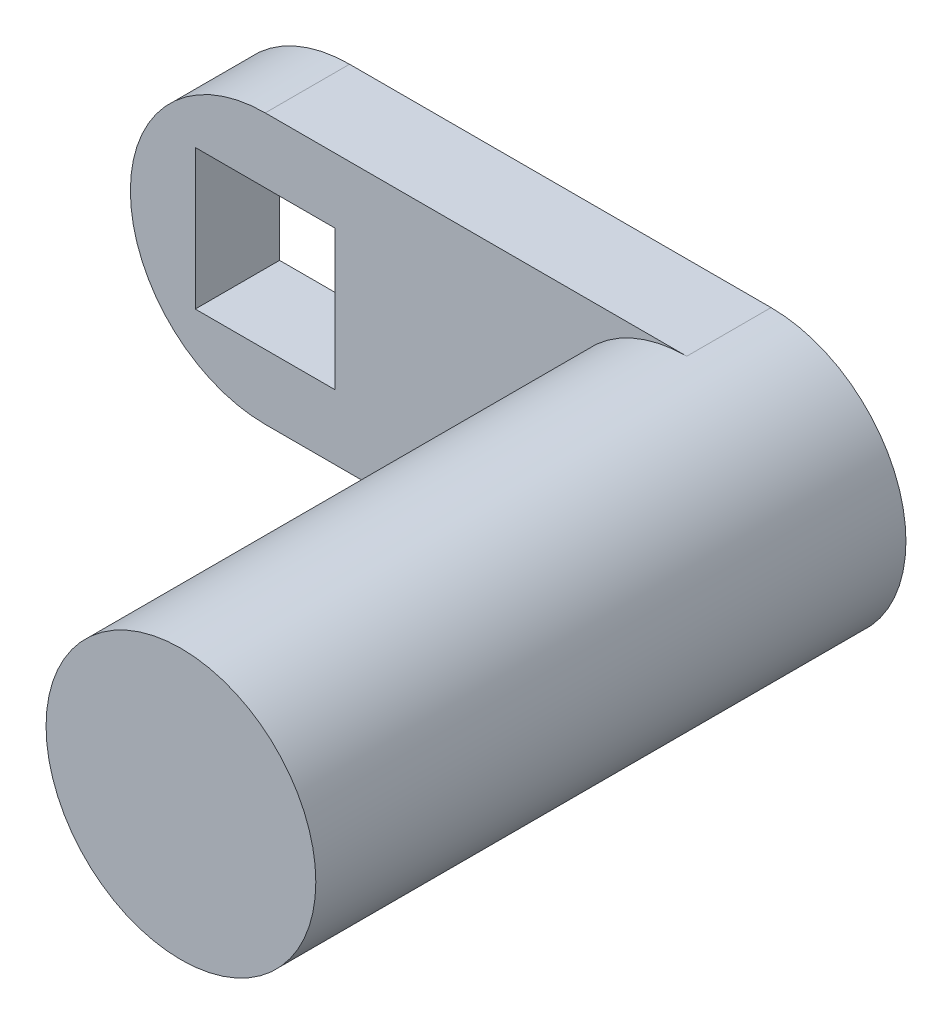
ISO-10303-21;
HEADER;
FILE_DESCRIPTION(('STEP AP214'),'2;1');
FILE_NAME('part.step','',(''),(''),'','','');
FILE_SCHEMA(('AUTOMOTIVE_DESIGN { 1 0 10303 214 1 1 1 1 }'));
ENDSEC;
DATA;
#1=APPLICATION_CONTEXT('core data for automotive mechanical design processes');
#2=APPLICATION_PROTOCOL_DEFINITION('international standard','automotive_design',2000,#1);
#3=PRODUCT_CONTEXT('',#1,'mechanical');
#4=PRODUCT('Part','Part','',(#3));
#5=PRODUCT_RELATED_PRODUCT_CATEGORY('part','',(#4));
#6=PRODUCT_DEFINITION_FORMATION('','',#4);
#7=PRODUCT_DEFINITION_CONTEXT('part definition',#1,'design');
#8=PRODUCT_DEFINITION('design','',#6,#7);
#9=PRODUCT_DEFINITION_SHAPE('','',#8);
#10=(LENGTH_UNIT() NAMED_UNIT(*) SI_UNIT(.MILLI.,.METRE.));
#11=(NAMED_UNIT(*) PLANE_ANGLE_UNIT() SI_UNIT($,.RADIAN.));
#12=(NAMED_UNIT(*) SI_UNIT($,.STERADIAN.) SOLID_ANGLE_UNIT());
#13=UNCERTAINTY_MEASURE_WITH_UNIT(LENGTH_MEASURE(1.E-05),#10,'distance_accuracy_value','');
#14=(GEOMETRIC_REPRESENTATION_CONTEXT(3) GLOBAL_UNCERTAINTY_ASSIGNED_CONTEXT((#13)) GLOBAL_UNIT_ASSIGNED_CONTEXT((#10,
#11,#12)) REPRESENTATION_CONTEXT('',''));
#15=CARTESIAN_POINT('',(0.,0.,0.));
#16=DIRECTION('',(0.,0.,1.));
#17=DIRECTION('',(1.,0.,0.));
#18=AXIS2_PLACEMENT_3D('',#15,#16,#17);
#19=CARTESIAN_POINT('',(0.,0.,5.));
#20=DIRECTION('',(0.,0.,1.));
#21=DIRECTION('',(1.,0.,0.));
#22=AXIS2_PLACEMENT_3D('',#19,#20,#21);
#23=PLANE('',#22);
#24=CARTESIAN_POINT('',(25.,0.,5.));
#25=DIRECTION('',(0.,0.,1.));
#26=DIRECTION('',(1.,0.,0.));
#27=AXIS2_PLACEMENT_3D('',#24,#25,#26);
#28=CIRCLE('',#27,8.);
#29=CARTESIAN_POINT('',(25.,8.,5.));
#30=VERTEX_POINT('',#29);
#31=CARTESIAN_POINT('',(25.,-8.,5.));
#32=VERTEX_POINT('',#31);
#33=EDGE_CURVE('E120',#30,#32,#28,.T.);
#34=ORIENTED_EDGE('',*,*,#33,.F.);
#35=DIRECTION('',(-1.,0.,0.));
#36=VECTOR('',#35,1.);
#37=CARTESIAN_POINT('',(0.,8.,5.));
#38=LINE('',#37,#36);
#39=CARTESIAN_POINT('',(0.,8.,5.));
#40=VERTEX_POINT('',#39);
#41=EDGE_CURVE('E102',#30,#40,#38,.T.);
#42=ORIENTED_EDGE('',*,*,#41,.T.);
#43=CARTESIAN_POINT('',(0.,0.,5.));
#44=DIRECTION('',(0.,0.,1.));
#45=DIRECTION('',(1.,0.,0.));
#46=AXIS2_PLACEMENT_3D('',#43,#44,#45);
#47=CIRCLE('',#46,8.);
#48=CARTESIAN_POINT('',(0.,-8.,5.));
#49=VERTEX_POINT('',#48);
#50=EDGE_CURVE('E157',#40,#49,#47,.T.);
#51=ORIENTED_EDGE('',*,*,#50,.T.);
#52=DIRECTION('',(1.,0.,0.));
#53=VECTOR('',#52,1.);
#54=CARTESIAN_POINT('',(0.,-8.,5.));
#55=LINE('',#54,#53);
#56=EDGE_CURVE('E113',#49,#32,#55,.T.);
#57=ORIENTED_EDGE('',*,*,#56,.T.);
#58=EDGE_LOOP('',(#34,#42,#51,#57));
#59=FACE_BOUND('',#58,.T.);
#60=DIRECTION('',(-1.,0.,0.));
#61=VECTOR('',#60,1.);
#62=CARTESIAN_POINT('',(-4.15,4.15,5.));
#63=LINE('',#62,#61);
#64=CARTESIAN_POINT('',(4.15,4.15,5.));
#65=VERTEX_POINT('',#64);
#66=CARTESIAN_POINT('',(-4.15,4.15,5.));
#67=VERTEX_POINT('',#66);
#68=EDGE_CURVE('E133',#65,#67,#63,.T.);
#69=ORIENTED_EDGE('',*,*,#68,.F.);
#70=DIRECTION('',(0.,1.,0.));
#71=VECTOR('',#70,1.);
#72=CARTESIAN_POINT('',(4.15,-4.15,5.));
#73=LINE('',#72,#71);
#74=CARTESIAN_POINT('',(4.15,-4.15,5.));
#75=VERTEX_POINT('',#74);
#76=EDGE_CURVE('E131',#75,#65,#73,.T.);
#77=ORIENTED_EDGE('',*,*,#76,.F.);
#78=DIRECTION('',(1.,0.,0.));
#79=VECTOR('',#78,1.);
#80=CARTESIAN_POINT('',(-4.15,-4.15,5.));
#81=LINE('',#80,#79);
#82=CARTESIAN_POINT('',(-4.15,-4.15,5.));
#83=VERTEX_POINT('',#82);
#84=EDGE_CURVE('E138',#83,#75,#81,.T.);
#85=ORIENTED_EDGE('',*,*,#84,.F.);
#86=DIRECTION('',(0.,-1.,0.));
#87=VECTOR('',#86,1.);
#88=CARTESIAN_POINT('',(-4.15,-4.15,5.));
#89=LINE('',#88,#87);
#90=EDGE_CURVE('E136',#67,#83,#89,.T.);
#91=ORIENTED_EDGE('',*,*,#90,.F.);
#92=EDGE_LOOP('',(#69,#77,#85,#91));
#93=FACE_BOUND('',#92,.T.);
#94=ADVANCED_FACE('F35',(#59,#93),#23,.T.);
#95=CARTESIAN_POINT('',(0.,0.,0.));
#96=DIRECTION('',(0.,0.,1.));
#97=DIRECTION('',(1.,0.,0.));
#98=AXIS2_PLACEMENT_3D('',#95,#96,#97);
#99=PLANE('',#98);
#100=CARTESIAN_POINT('',(0.,0.,0.));
#101=DIRECTION('',(0.,0.,1.));
#102=DIRECTION('',(1.,0.,0.));
#103=AXIS2_PLACEMENT_3D('',#100,#101,#102);
#104=CIRCLE('',#103,8.);
#105=CARTESIAN_POINT('',(0.,8.,0.));
#106=VERTEX_POINT('',#105);
#107=CARTESIAN_POINT('',(0.,-8.,0.));
#108=VERTEX_POINT('',#107);
#109=EDGE_CURVE('E156',#106,#108,#104,.T.);
#110=ORIENTED_EDGE('',*,*,#109,.F.);
#111=DIRECTION('',(-1.,0.,0.));
#112=VECTOR('',#111,1.);
#113=CARTESIAN_POINT('',(0.,8.,0.));
#114=LINE('',#113,#112);
#115=CARTESIAN_POINT('',(25.,8.,0.));
#116=VERTEX_POINT('',#115);
#117=EDGE_CURVE('E159',#116,#106,#114,.T.);
#118=ORIENTED_EDGE('',*,*,#117,.F.);
#119=CARTESIAN_POINT('',(25.,0.,0.));
#120=DIRECTION('',(0.,0.,1.));
#121=DIRECTION('',(1.,0.,0.));
#122=AXIS2_PLACEMENT_3D('',#119,#120,#121);
#123=CIRCLE('',#122,8.);
#124=CARTESIAN_POINT('',(25.,-8.,0.));
#125=VERTEX_POINT('',#124);
#126=EDGE_CURVE('E122',#125,#116,#123,.T.);
#127=ORIENTED_EDGE('',*,*,#126,.F.);
#128=DIRECTION('',(1.,0.,0.));
#129=VECTOR('',#128,1.);
#130=CARTESIAN_POINT('',(0.,-8.,0.));
#131=LINE('',#130,#129);
#132=EDGE_CURVE('E163',#108,#125,#131,.T.);
#133=ORIENTED_EDGE('',*,*,#132,.F.);
#134=EDGE_LOOP('',(#110,#118,#127,#133));
#135=FACE_BOUND('',#134,.T.);
#136=DIRECTION('',(0.,1.,0.));
#137=VECTOR('',#136,1.);
#138=CARTESIAN_POINT('',(4.15,-4.15,0.));
#139=LINE('',#138,#137);
#140=CARTESIAN_POINT('',(4.15,-4.15,0.));
#141=VERTEX_POINT('',#140);
#142=CARTESIAN_POINT('',(4.15,4.15,0.));
#143=VERTEX_POINT('',#142);
#144=EDGE_CURVE('E58',#141,#143,#139,.T.);
#145=ORIENTED_EDGE('',*,*,#144,.T.);
#146=DIRECTION('',(-1.,0.,0.));
#147=VECTOR('',#146,1.);
#148=CARTESIAN_POINT('',(-4.15,4.15,0.));
#149=LINE('',#148,#147);
#150=CARTESIAN_POINT('',(-4.15,4.15,0.));
#151=VERTEX_POINT('',#150);
#152=EDGE_CURVE('E142',#143,#151,#149,.T.);
#153=ORIENTED_EDGE('',*,*,#152,.T.);
#154=DIRECTION('',(0.,-1.,0.));
#155=VECTOR('',#154,1.);
#156=CARTESIAN_POINT('',(-4.15,-4.15,0.));
#157=LINE('',#156,#155);
#158=CARTESIAN_POINT('',(-4.15,-4.15,0.));
#159=VERTEX_POINT('',#158);
#160=EDGE_CURVE('E145',#151,#159,#157,.T.);
#161=ORIENTED_EDGE('',*,*,#160,.T.);
#162=DIRECTION('',(1.,0.,0.));
#163=VECTOR('',#162,1.);
#164=CARTESIAN_POINT('',(-4.15,-4.15,0.));
#165=LINE('',#164,#163);
#166=EDGE_CURVE('E134',#159,#141,#165,.T.);
#167=ORIENTED_EDGE('',*,*,#166,.T.);
#168=EDGE_LOOP('',(#145,#153,#161,#167));
#169=FACE_BOUND('',#168,.T.);
#170=ADVANCED_FACE('F170',(#135,#169),#99,.F.);
#171=CARTESIAN_POINT('',(0.,0.,5.));
#172=DIRECTION('',(0.,0.,-1.));
#173=DIRECTION('',(-1.,0.,0.));
#174=AXIS2_PLACEMENT_3D('',#171,#172,#173);
#175=CYLINDRICAL_SURFACE('',#174,8.);
#176=ORIENTED_EDGE('',*,*,#109,.T.);
#177=DIRECTION('',(0.,0.,-1.));
#178=VECTOR('',#177,1.);
#179=CARTESIAN_POINT('',(0.,-8.,5.));
#180=LINE('',#179,#178);
#181=EDGE_CURVE('E11',#49,#108,#180,.T.);
#182=ORIENTED_EDGE('',*,*,#181,.F.);
#183=ORIENTED_EDGE('',*,*,#50,.F.);
#184=DIRECTION('',(0.,0.,-1.));
#185=VECTOR('',#184,1.);
#186=CARTESIAN_POINT('',(0.,8.,5.));
#187=LINE('',#186,#185);
#188=EDGE_CURVE('E108',#40,#106,#187,.T.);
#189=ORIENTED_EDGE('',*,*,#188,.T.);
#190=EDGE_LOOP('',(#176,#182,#183,#189));
#191=FACE_BOUND('',#190,.T.);
#192=ADVANCED_FACE('F37',(#191),#175,.T.);
#193=CARTESIAN_POINT('',(0.,-8.,5.));
#194=DIRECTION('',(0.,1.,0.));
#195=DIRECTION('',(0.,0.,1.));
#196=AXIS2_PLACEMENT_3D('',#193,#194,#195);
#197=PLANE('',#196);
#198=ORIENTED_EDGE('',*,*,#132,.T.);
#199=DIRECTION('',(0.,0.,-1.));
#200=VECTOR('',#199,1.);
#201=CARTESIAN_POINT('',(25.,-8.,5.));
#202=LINE('',#201,#200);
#203=EDGE_CURVE('E43',#32,#125,#202,.T.);
#204=ORIENTED_EDGE('',*,*,#203,.F.);
#205=ORIENTED_EDGE('',*,*,#56,.F.);
#206=ORIENTED_EDGE('',*,*,#181,.T.);
#207=EDGE_LOOP('',(#198,#204,#205,#206));
#208=FACE_BOUND('',#207,.T.);
#209=ADVANCED_FACE('F174',(#208),#197,.F.);
#210=CARTESIAN_POINT('',(25.,0.,5.));
#211=DIRECTION('',(0.,0.,-1.));
#212=DIRECTION('',(-1.,0.,0.));
#213=AXIS2_PLACEMENT_3D('',#210,#211,#212);
#214=CYLINDRICAL_SURFACE('',#213,8.);
#215=ORIENTED_EDGE('',*,*,#126,.T.);
#216=DIRECTION('',(0.,0.,-1.));
#217=VECTOR('',#216,1.);
#218=CARTESIAN_POINT('',(25.,8.,5.));
#219=LINE('',#218,#217);
#220=EDGE_CURVE('E105',#30,#116,#219,.T.);
#221=ORIENTED_EDGE('',*,*,#220,.F.);
#222=ORIENTED_EDGE('',*,*,#33,.T.);
#223=ORIENTED_EDGE('',*,*,#203,.T.);
#224=EDGE_LOOP('',(#215,#221,#222,#223));
#225=FACE_BOUND('',#224,.T.);
#226=CARTESIAN_POINT('',(25.,0.,35.));
#227=DIRECTION('',(0.,0.,1.));
#228=DIRECTION('',(1.,0.,0.));
#229=AXIS2_PLACEMENT_3D('',#226,#227,#228);
#230=CIRCLE('',#229,8.);
#231=CARTESIAN_POINT('',(33.,0.,35.));
#232=VERTEX_POINT('',#231);
#233=EDGE_CURVE('E126',#232,#232,#230,.T.);
#234=ORIENTED_EDGE('',*,*,#233,.F.);
#235=EDGE_LOOP('',(#234));
#236=FACE_BOUND('',#235,.T.);
#237=ADVANCED_FACE('F117',(#225,#236),#214,.T.);
#238=CARTESIAN_POINT('',(0.,8.,5.));
#239=DIRECTION('',(0.,-1.,0.));
#240=DIRECTION('',(0.,0.,-1.));
#241=AXIS2_PLACEMENT_3D('',#238,#239,#240);
#242=PLANE('',#241);
#243=ORIENTED_EDGE('',*,*,#117,.T.);
#244=ORIENTED_EDGE('',*,*,#188,.F.);
#245=ORIENTED_EDGE('',*,*,#41,.F.);
#246=ORIENTED_EDGE('',*,*,#220,.T.);
#247=EDGE_LOOP('',(#243,#244,#245,#246));
#248=FACE_BOUND('',#247,.T.);
#249=ADVANCED_FACE('F104',(#248),#242,.F.);
#250=CARTESIAN_POINT('',(4.15,-4.15,5.));
#251=DIRECTION('',(-1.,0.,0.));
#252=DIRECTION('',(0.,0.,1.));
#253=AXIS2_PLACEMENT_3D('',#250,#251,#252);
#254=PLANE('',#253);
#255=ORIENTED_EDGE('',*,*,#144,.F.);
#256=DIRECTION('',(0.,0.,-1.));
#257=VECTOR('',#256,1.);
#258=CARTESIAN_POINT('',(4.15,-4.15,5.));
#259=LINE('',#258,#257);
#260=EDGE_CURVE('E140',#75,#141,#259,.T.);
#261=ORIENTED_EDGE('',*,*,#260,.F.);
#262=ORIENTED_EDGE('',*,*,#76,.T.);
#263=DIRECTION('',(0.,0.,-1.));
#264=VECTOR('',#263,1.);
#265=CARTESIAN_POINT('',(4.15,4.15,5.));
#266=LINE('',#265,#264);
#267=EDGE_CURVE('E154',#65,#143,#266,.T.);
#268=ORIENTED_EDGE('',*,*,#267,.T.);
#269=EDGE_LOOP('',(#255,#261,#262,#268));
#270=FACE_BOUND('',#269,.T.);
#271=ADVANCED_FACE('F188',(#270),#254,.T.);
#272=CARTESIAN_POINT('',(-4.15,4.15,5.));
#273=DIRECTION('',(0.,-1.,0.));
#274=DIRECTION('',(0.,0.,-1.));
#275=AXIS2_PLACEMENT_3D('',#272,#273,#274);
#276=PLANE('',#275);
#277=ORIENTED_EDGE('',*,*,#152,.F.);
#278=ORIENTED_EDGE('',*,*,#267,.F.);
#279=ORIENTED_EDGE('',*,*,#68,.T.);
#280=DIRECTION('',(0.,0.,-1.));
#281=VECTOR('',#280,1.);
#282=CARTESIAN_POINT('',(-4.15,4.15,5.));
#283=LINE('',#282,#281);
#284=EDGE_CURVE('E152',#67,#151,#283,.T.);
#285=ORIENTED_EDGE('',*,*,#284,.T.);
#286=EDGE_LOOP('',(#277,#278,#279,#285));
#287=FACE_BOUND('',#286,.T.);
#288=ADVANCED_FACE('F195',(#287),#276,.T.);
#289=CARTESIAN_POINT('',(-4.15,-4.15,5.));
#290=DIRECTION('',(1.,0.,0.));
#291=DIRECTION('',(0.,0.,-1.));
#292=AXIS2_PLACEMENT_3D('',#289,#290,#291);
#293=PLANE('',#292);
#294=ORIENTED_EDGE('',*,*,#160,.F.);
#295=ORIENTED_EDGE('',*,*,#284,.F.);
#296=ORIENTED_EDGE('',*,*,#90,.T.);
#297=DIRECTION('',(0.,0.,-1.));
#298=VECTOR('',#297,1.);
#299=CARTESIAN_POINT('',(-4.15,-4.15,5.));
#300=LINE('',#299,#298);
#301=EDGE_CURVE('E50',#83,#159,#300,.T.);
#302=ORIENTED_EDGE('',*,*,#301,.T.);
#303=EDGE_LOOP('',(#294,#295,#296,#302));
#304=FACE_BOUND('',#303,.T.);
#305=ADVANCED_FACE('F199',(#304),#293,.T.);
#306=CARTESIAN_POINT('',(-4.15,-4.15,5.));
#307=DIRECTION('',(0.,1.,0.));
#308=DIRECTION('',(0.,0.,1.));
#309=AXIS2_PLACEMENT_3D('',#306,#307,#308);
#310=PLANE('',#309);
#311=ORIENTED_EDGE('',*,*,#166,.F.);
#312=ORIENTED_EDGE('',*,*,#301,.F.);
#313=ORIENTED_EDGE('',*,*,#84,.T.);
#314=ORIENTED_EDGE('',*,*,#260,.T.);
#315=EDGE_LOOP('',(#311,#312,#313,#314));
#316=FACE_BOUND('',#315,.T.);
#317=ADVANCED_FACE('F204',(#316),#310,.T.);
#318=CARTESIAN_POINT('',(25.,0.,35.));
#319=DIRECTION('',(0.,0.,1.));
#320=DIRECTION('',(1.,0.,0.));
#321=AXIS2_PLACEMENT_3D('',#318,#319,#320);
#322=PLANE('',#321);
#323=ORIENTED_EDGE('',*,*,#233,.T.);
#324=EDGE_LOOP('',(#323));
#325=FACE_BOUND('',#324,.T.);
#326=ADVANCED_FACE('F210',(#325),#322,.T.);
#327=CLOSED_SHELL('',(#94,#170,#192,#209,#237,#249,#271,#288,#305,#317,#326));
#328=MANIFOLD_SOLID_BREP('B2',#327);
#329=ADVANCED_BREP_SHAPE_REPRESENTATION('',(#18,#328),#14);
#330=SHAPE_DEFINITION_REPRESENTATION(#9,#329);
ENDSEC;
END-ISO-10303-21;
